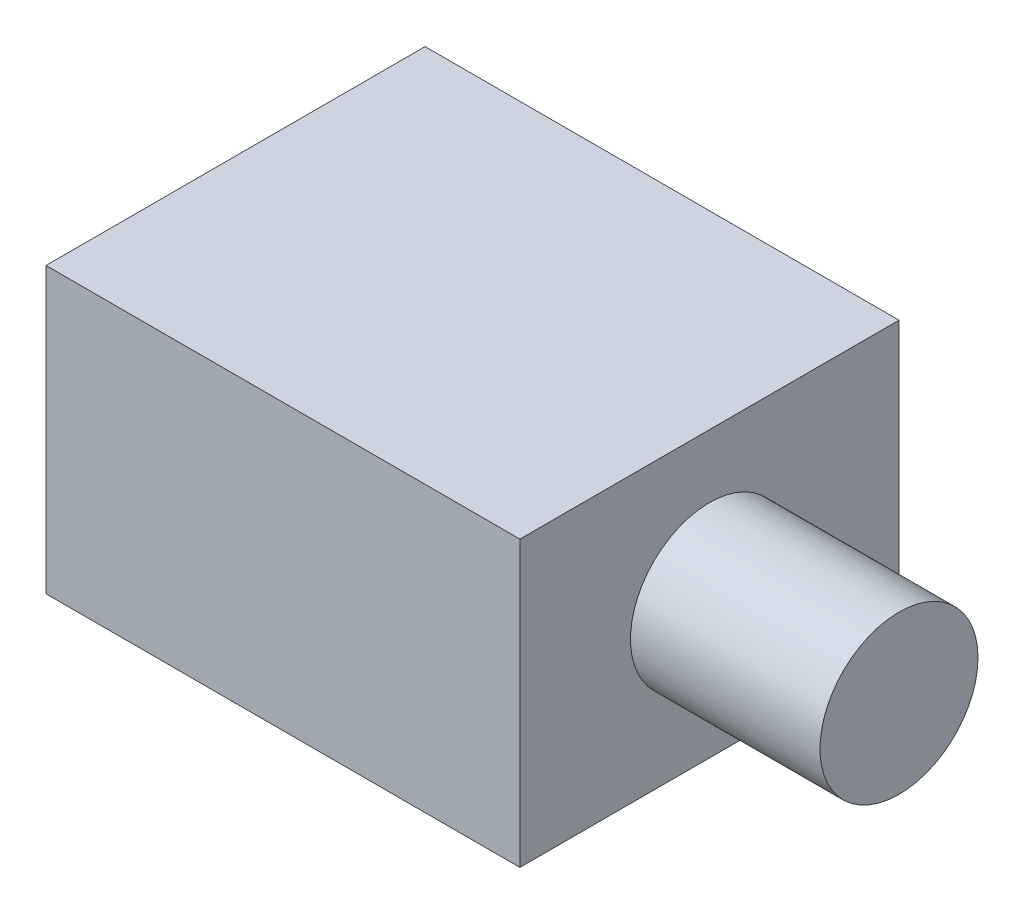
ISO-10303-21;
HEADER;
FILE_DESCRIPTION(('STEP AP214'),'2;1');
FILE_NAME('part.step','',(''),(''),'','','');
FILE_SCHEMA(('AUTOMOTIVE_DESIGN { 1 0 10303 214 1 1 1 1 }'));
ENDSEC;
DATA;
#1=APPLICATION_CONTEXT('core data for automotive mechanical design processes');
#2=APPLICATION_PROTOCOL_DEFINITION('international standard','automotive_design',2000,#1);
#3=PRODUCT_CONTEXT('',#1,'mechanical');
#4=PRODUCT('Part','Part','',(#3));
#5=PRODUCT_RELATED_PRODUCT_CATEGORY('part','',(#4));
#6=PRODUCT_DEFINITION_FORMATION('','',#4);
#7=PRODUCT_DEFINITION_CONTEXT('part definition',#1,'design');
#8=PRODUCT_DEFINITION('design','',#6,#7);
#9=PRODUCT_DEFINITION_SHAPE('','',#8);
#10=(LENGTH_UNIT() NAMED_UNIT(*) SI_UNIT(.MILLI.,.METRE.));
#11=(NAMED_UNIT(*) PLANE_ANGLE_UNIT() SI_UNIT($,.RADIAN.));
#12=(NAMED_UNIT(*) SI_UNIT($,.STERADIAN.) SOLID_ANGLE_UNIT());
#13=UNCERTAINTY_MEASURE_WITH_UNIT(LENGTH_MEASURE(1.E-05),#10,'distance_accuracy_value','');
#14=(GEOMETRIC_REPRESENTATION_CONTEXT(3) GLOBAL_UNCERTAINTY_ASSIGNED_CONTEXT((#13)) GLOBAL_UNIT_ASSIGNED_CONTEXT((#10,
#11,#12)) REPRESENTATION_CONTEXT('',''));
#15=CARTESIAN_POINT('',(0.,0.,0.));
#16=DIRECTION('',(0.,0.,1.));
#17=DIRECTION('',(1.,0.,0.));
#18=AXIS2_PLACEMENT_3D('',#15,#16,#17);
#19=CARTESIAN_POINT('',(-30.,36.,24.));
#20=DIRECTION('',(1.,0.,0.));
#21=DIRECTION('',(0.,0.,-1.));
#22=AXIS2_PLACEMENT_3D('',#19,#20,#21);
#23=PLANE('',#22);
#24=DIRECTION('',(0.,0.,1.));
#25=VECTOR('',#24,1.);
#26=CARTESIAN_POINT('',(-30.,0.,24.));
#27=LINE('',#26,#25);
#28=CARTESIAN_POINT('',(-30.,0.,-24.));
#29=VERTEX_POINT('',#28);
#30=CARTESIAN_POINT('',(-30.,0.,24.));
#31=VERTEX_POINT('',#30);
#32=EDGE_CURVE('E122',#29,#31,#27,.T.);
#33=ORIENTED_EDGE('',*,*,#32,.T.);
#34=DIRECTION('',(0.,-1.,0.));
#35=VECTOR('',#34,1.);
#36=CARTESIAN_POINT('',(-30.,36.,24.));
#37=LINE('',#36,#35);
#38=CARTESIAN_POINT('',(-30.,36.,24.));
#39=VERTEX_POINT('',#38);
#40=EDGE_CURVE('E11',#39,#31,#37,.T.);
#41=ORIENTED_EDGE('',*,*,#40,.F.);
#42=DIRECTION('',(0.,0.,1.));
#43=VECTOR('',#42,1.);
#44=CARTESIAN_POINT('',(-30.,36.,24.));
#45=LINE('',#44,#43);
#46=CARTESIAN_POINT('',(-30.,36.,-24.));
#47=VERTEX_POINT('',#46);
#48=EDGE_CURVE('E104',#47,#39,#45,.T.);
#49=ORIENTED_EDGE('',*,*,#48,.F.);
#50=DIRECTION('',(0.,-1.,0.));
#51=VECTOR('',#50,1.);
#52=CARTESIAN_POINT('',(-30.,36.,-24.));
#53=LINE('',#52,#51);
#54=EDGE_CURVE('E118',#47,#29,#53,.T.);
#55=ORIENTED_EDGE('',*,*,#54,.T.);
#56=EDGE_LOOP('',(#33,#41,#49,#55));
#57=FACE_BOUND('',#56,.T.);
#58=ADVANCED_FACE('F51',(#57),#23,.F.);
#59=CARTESIAN_POINT('',(30.,36.,24.));
#60=DIRECTION('',(0.,0.,-1.));
#61=DIRECTION('',(-1.,0.,0.));
#62=AXIS2_PLACEMENT_3D('',#59,#60,#61);
#63=PLANE('',#62);
#64=DIRECTION('',(1.,0.,0.));
#65=VECTOR('',#64,1.);
#66=CARTESIAN_POINT('',(30.,0.,24.));
#67=LINE('',#66,#65);
#68=CARTESIAN_POINT('',(30.,0.,24.));
#69=VERTEX_POINT('',#68);
#70=EDGE_CURVE('E109',#31,#69,#67,.T.);
#71=ORIENTED_EDGE('',*,*,#70,.T.);
#72=DIRECTION('',(0.,-1.,0.));
#73=VECTOR('',#72,1.);
#74=CARTESIAN_POINT('',(30.,36.,24.));
#75=LINE('',#74,#73);
#76=CARTESIAN_POINT('',(30.,36.,24.));
#77=VERTEX_POINT('',#76);
#78=EDGE_CURVE('E61',#77,#69,#75,.T.);
#79=ORIENTED_EDGE('',*,*,#78,.F.);
#80=DIRECTION('',(1.,0.,0.));
#81=VECTOR('',#80,1.);
#82=CARTESIAN_POINT('',(30.,36.,24.));
#83=LINE('',#82,#81);
#84=EDGE_CURVE('E99',#39,#77,#83,.T.);
#85=ORIENTED_EDGE('',*,*,#84,.F.);
#86=ORIENTED_EDGE('',*,*,#40,.T.);
#87=EDGE_LOOP('',(#71,#79,#85,#86));
#88=FACE_BOUND('',#87,.T.);
#89=ADVANCED_FACE('F108',(#88),#63,.F.);
#90=CARTESIAN_POINT('',(30.,36.,-24.));
#91=DIRECTION('',(-1.,0.,0.));
#92=DIRECTION('',(0.,0.,1.));
#93=AXIS2_PLACEMENT_3D('',#90,#91,#92);
#94=PLANE('',#93);
#95=CARTESIAN_POINT('',(30.,18.,0.));
#96=DIRECTION('',(1.,0.,0.));
#97=DIRECTION('',(0.,0.,-1.));
#98=AXIS2_PLACEMENT_3D('',#95,#96,#97);
#99=CIRCLE('',#98,10.);
#100=CARTESIAN_POINT('',(30.,18.,-10.));
#101=VERTEX_POINT('',#100);
#102=EDGE_CURVE('E126',#101,#101,#99,.F.);
#103=ORIENTED_EDGE('',*,*,#102,.T.);
#104=EDGE_LOOP('',(#103));
#105=FACE_BOUND('',#104,.T.);
#106=DIRECTION('',(0.,0.,-1.));
#107=VECTOR('',#106,1.);
#108=CARTESIAN_POINT('',(30.,0.,-24.));
#109=LINE('',#108,#107);
#110=CARTESIAN_POINT('',(30.,0.,-24.));
#111=VERTEX_POINT('',#110);
#112=EDGE_CURVE('E86',#69,#111,#109,.T.);
#113=ORIENTED_EDGE('',*,*,#112,.T.);
#114=DIRECTION('',(0.,-1.,0.));
#115=VECTOR('',#114,1.);
#116=CARTESIAN_POINT('',(30.,36.,-24.));
#117=LINE('',#116,#115);
#118=CARTESIAN_POINT('',(30.,36.,-24.));
#119=VERTEX_POINT('',#118);
#120=EDGE_CURVE('E111',#119,#111,#117,.T.);
#121=ORIENTED_EDGE('',*,*,#120,.F.);
#122=DIRECTION('',(0.,0.,-1.));
#123=VECTOR('',#122,1.);
#124=CARTESIAN_POINT('',(30.,36.,-24.));
#125=LINE('',#124,#123);
#126=EDGE_CURVE('E102',#77,#119,#125,.T.);
#127=ORIENTED_EDGE('',*,*,#126,.F.);
#128=ORIENTED_EDGE('',*,*,#78,.T.);
#129=EDGE_LOOP('',(#113,#121,#127,#128));
#130=FACE_BOUND('',#129,.T.);
#131=ADVANCED_FACE('F112',(#105,#130),#94,.F.);
#132=CARTESIAN_POINT('',(-30.,36.,-24.));
#133=DIRECTION('',(0.,0.,1.));
#134=DIRECTION('',(1.,0.,0.));
#135=AXIS2_PLACEMENT_3D('',#132,#133,#134);
#136=PLANE('',#135);
#137=DIRECTION('',(-1.,0.,0.));
#138=VECTOR('',#137,1.);
#139=CARTESIAN_POINT('',(-30.,0.,-24.));
#140=LINE('',#139,#138);
#141=EDGE_CURVE('E92',#111,#29,#140,.T.);
#142=ORIENTED_EDGE('',*,*,#141,.T.);
#143=ORIENTED_EDGE('',*,*,#54,.F.);
#144=DIRECTION('',(-1.,0.,0.));
#145=VECTOR('',#144,1.);
#146=CARTESIAN_POINT('',(-30.,36.,-24.));
#147=LINE('',#146,#145);
#148=EDGE_CURVE('E69',#119,#47,#147,.T.);
#149=ORIENTED_EDGE('',*,*,#148,.F.);
#150=ORIENTED_EDGE('',*,*,#120,.T.);
#151=EDGE_LOOP('',(#142,#143,#149,#150));
#152=FACE_BOUND('',#151,.T.);
#153=ADVANCED_FACE('F136',(#152),#136,.F.);
#154=CARTESIAN_POINT('',(0.,36.,0.));
#155=DIRECTION('',(0.,-1.,0.));
#156=DIRECTION('',(0.,0.,-1.));
#157=AXIS2_PLACEMENT_3D('',#154,#155,#156);
#158=PLANE('',#157);
#159=ORIENTED_EDGE('',*,*,#48,.T.);
#160=ORIENTED_EDGE('',*,*,#84,.T.);
#161=ORIENTED_EDGE('',*,*,#126,.T.);
#162=ORIENTED_EDGE('',*,*,#148,.T.);
#163=EDGE_LOOP('',(#159,#160,#161,#162));
#164=FACE_BOUND('',#163,.T.);
#165=ADVANCED_FACE('F100',(#164),#158,.F.);
#166=CARTESIAN_POINT('',(0.,0.,0.));
#167=DIRECTION('',(0.,-1.,0.));
#168=DIRECTION('',(0.,0.,-1.));
#169=AXIS2_PLACEMENT_3D('',#166,#167,#168);
#170=PLANE('',#169);
#171=ORIENTED_EDGE('',*,*,#32,.F.);
#172=ORIENTED_EDGE('',*,*,#141,.F.);
#173=ORIENTED_EDGE('',*,*,#112,.F.);
#174=ORIENTED_EDGE('',*,*,#70,.F.);
#175=EDGE_LOOP('',(#171,#172,#173,#174));
#176=FACE_BOUND('',#175,.T.);
#177=ADVANCED_FACE('F139',(#176),#170,.T.);
#178=CARTESIAN_POINT('',(1.7157287525381,18.,0.));
#179=DIRECTION('',(1.,0.,0.));
#180=DIRECTION('',(0.,0.,-1.));
#181=AXIS2_PLACEMENT_3D('',#178,#179,#180);
#182=CYLINDRICAL_SURFACE('',#181,10.);
#183=CARTESIAN_POINT('',(54.,18.,0.));
#184=DIRECTION('',(1.,0.,0.));
#185=DIRECTION('',(0.,0.,-1.));
#186=AXIS2_PLACEMENT_3D('',#183,#184,#185);
#187=CIRCLE('',#186,10.);
#188=CARTESIAN_POINT('',(54.,18.,-10.));
#189=VERTEX_POINT('',#188);
#190=EDGE_CURVE('E145',#189,#189,#187,.T.);
#191=CARTESIAN_POINT('',(30.,18.,-10.));
#192=CARTESIAN_POINT('',(30.25,18.,-10.));
#193=CARTESIAN_POINT('',(30.5,18.,-10.));
#194=CARTESIAN_POINT('',(31.,18.,-10.));
#195=CARTESIAN_POINT('',(31.25,18.,-10.));
#196=CARTESIAN_POINT('',(31.75,18.,-10.));
#197=CARTESIAN_POINT('',(32.,18.,-10.));
#198=CARTESIAN_POINT('',(32.5,18.,-10.));
#199=CARTESIAN_POINT('',(32.75,18.,-10.));
#200=CARTESIAN_POINT('',(33.25,18.,-10.));
#201=CARTESIAN_POINT('',(33.5,18.,-10.));
#202=CARTESIAN_POINT('',(34.,18.,-10.));
#203=CARTESIAN_POINT('',(34.25,18.,-10.));
#204=CARTESIAN_POINT('',(34.75,18.,-10.));
#205=CARTESIAN_POINT('',(35.,18.,-10.));
#206=CARTESIAN_POINT('',(35.5,18.,-10.));
#207=CARTESIAN_POINT('',(35.75,18.,-10.));
#208=CARTESIAN_POINT('',(36.25,18.,-10.));
#209=CARTESIAN_POINT('',(36.5,18.,-10.));
#210=CARTESIAN_POINT('',(37.,18.,-10.));
#211=CARTESIAN_POINT('',(37.25,18.,-10.));
#212=CARTESIAN_POINT('',(37.75,18.,-10.));
#213=CARTESIAN_POINT('',(38.,18.,-10.));
#214=CARTESIAN_POINT('',(38.5,18.,-10.));
#215=CARTESIAN_POINT('',(38.75,18.,-10.));
#216=CARTESIAN_POINT('',(39.25,18.,-10.));
#217=CARTESIAN_POINT('',(39.5,18.,-10.));
#218=CARTESIAN_POINT('',(40.,18.,-10.));
#219=CARTESIAN_POINT('',(40.25,18.,-10.));
#220=CARTESIAN_POINT('',(40.75,18.,-10.));
#221=CARTESIAN_POINT('',(41.,18.,-10.));
#222=CARTESIAN_POINT('',(41.5,18.,-10.));
#223=CARTESIAN_POINT('',(41.75,18.,-10.));
#224=CARTESIAN_POINT('',(42.25,18.,-10.));
#225=CARTESIAN_POINT('',(42.5,18.,-10.));
#226=CARTESIAN_POINT('',(43.,18.,-10.));
#227=CARTESIAN_POINT('',(43.25,18.,-10.));
#228=CARTESIAN_POINT('',(43.75,18.,-10.));
#229=CARTESIAN_POINT('',(44.,18.,-10.));
#230=CARTESIAN_POINT('',(44.5,18.,-10.));
#231=CARTESIAN_POINT('',(44.75,18.,-10.));
#232=CARTESIAN_POINT('',(45.25,18.,-10.));
#233=CARTESIAN_POINT('',(45.5,18.,-10.));
#234=CARTESIAN_POINT('',(46.,18.,-10.));
#235=CARTESIAN_POINT('',(46.25,18.,-10.));
#236=CARTESIAN_POINT('',(46.75,18.,-10.));
#237=CARTESIAN_POINT('',(47.,18.,-10.));
#238=CARTESIAN_POINT('',(47.5,18.,-10.));
#239=CARTESIAN_POINT('',(47.75,18.,-10.));
#240=CARTESIAN_POINT('',(48.25,18.,-10.));
#241=CARTESIAN_POINT('',(48.5,18.,-10.));
#242=CARTESIAN_POINT('',(49.,18.,-10.));
#243=CARTESIAN_POINT('',(49.25,18.,-10.));
#244=CARTESIAN_POINT('',(49.75,18.,-10.));
#245=CARTESIAN_POINT('',(50.,18.,-10.));
#246=CARTESIAN_POINT('',(50.5,18.,-10.));
#247=CARTESIAN_POINT('',(50.75,18.,-10.));
#248=CARTESIAN_POINT('',(51.25,18.,-10.));
#249=CARTESIAN_POINT('',(51.5,18.,-10.));
#250=CARTESIAN_POINT('',(52.,18.,-10.));
#251=CARTESIAN_POINT('',(52.25,18.,-10.));
#252=CARTESIAN_POINT('',(52.75,18.,-10.));
#253=CARTESIAN_POINT('',(53.,18.,-10.));
#254=CARTESIAN_POINT('',(53.5,18.,-10.));
#255=CARTESIAN_POINT('',(53.75,18.,-10.));
#256=CARTESIAN_POINT('',(54.,18.,-10.));
#257=B_SPLINE_CURVE_WITH_KNOTS('',3,(#191,#192,#193,#194,#195,#196,#197,#198,#199,#200,#201,
#202,#203,#204,#205,#206,#207,#208,#209,#210,#211,#212,#213,#214,#215,#216,#217,#218,#219,#220,
#221,#222,#223,#224,#225,#226,#227,#228,#229,#230,#231,#232,#233,#234,#235,#236,#237,#238,#239,
#240,#241,#242,#243,#244,#245,#246,#247,#248,#249,#250,#251,#252,#253,#254,#255,#256),
.UNSPECIFIED.,.F.,.F.,(4,2,2,2,2,2,2,2,2,2,2,2,2,2,2,2,2,2,2,2,2,2,2,2,2,2,2,2,2,2,2,2,4),(0.,
0.750000000000001,1.5,2.25000000000001,3.,3.75,4.5,5.25,6.,6.75,7.5,8.25,9.,9.75,10.5,11.25,12.,
12.75,13.5,14.25,15.,15.75,16.5,17.25,18.,18.75,19.5,20.25,21.,21.75,22.5,23.25,24.),.UNSPECIFIED.);
#258=EDGE_CURVE('BSEAM151',#101,#189,#257,.T.);
#259=ORIENTED_EDGE('',*,*,#102,.F.);
#260=ORIENTED_EDGE('',*,*,#190,.F.);
#261=ORIENTED_EDGE('',*,*,#258,.T.);
#262=ORIENTED_EDGE('',*,*,#258,.F.);
#263=EDGE_LOOP('',(#259,#261,#260,#262));
#264=FACE_BOUND('',#263,.T.);
#265=ADVANCED_FACE('F151',(#264),#182,.T.);
#266=CARTESIAN_POINT('',(54.,18.,0.));
#267=DIRECTION('',(1.,0.,0.));
#268=DIRECTION('',(0.,0.,-1.));
#269=AXIS2_PLACEMENT_3D('',#266,#267,#268);
#270=PLANE('',#269);
#271=ORIENTED_EDGE('',*,*,#190,.T.);
#272=EDGE_LOOP('',(#271));
#273=FACE_BOUND('',#272,.T.);
#274=ADVANCED_FACE('F149',(#273),#270,.T.);
#275=CLOSED_SHELL('',(#58,#89,#131,#153,#165,#177,#265,#274));
#276=MANIFOLD_SOLID_BREP('B2',#275);
#277=ADVANCED_BREP_SHAPE_REPRESENTATION('',(#18,#276),#14);
#278=SHAPE_DEFINITION_REPRESENTATION(#9,#277);
ENDSEC;
END-ISO-10303-21;
